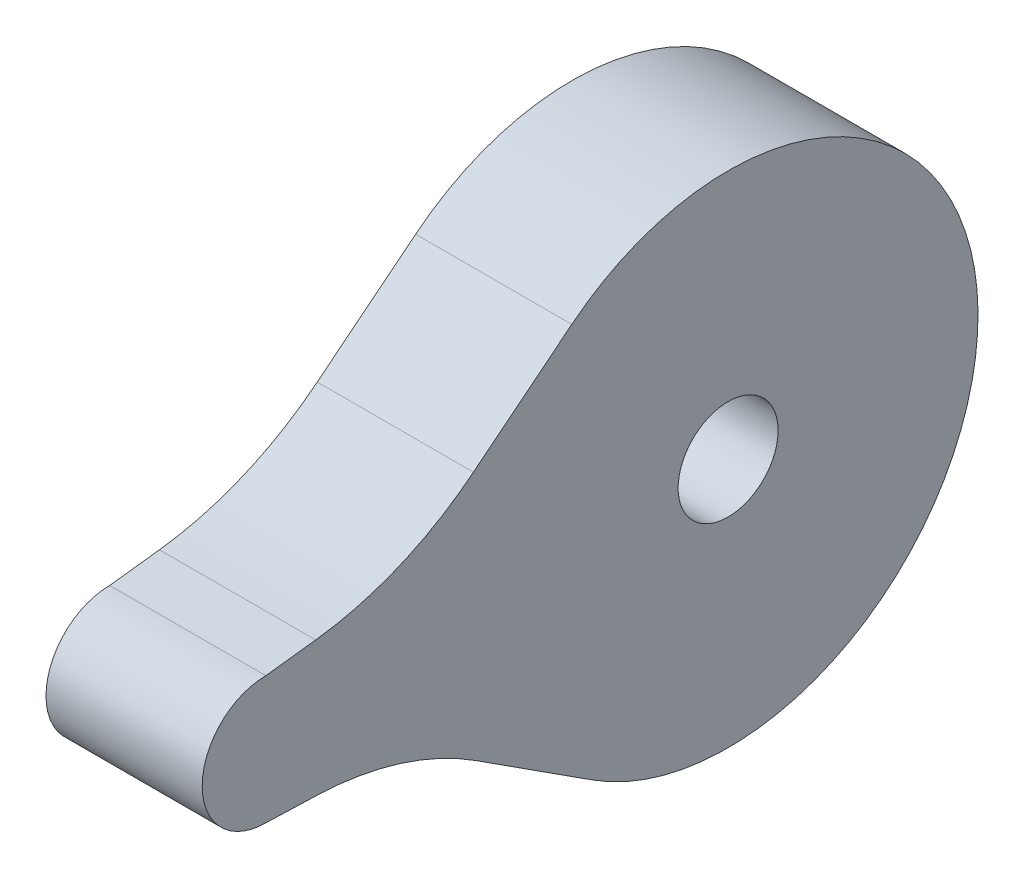
ISO-10303-21;
HEADER;
FILE_DESCRIPTION(('STEP AP214'),'2;1');
FILE_NAME('part.step','',(''),(''),'','','');
FILE_SCHEMA(('AUTOMOTIVE_DESIGN { 1 0 10303 214 1 1 1 1 }'));
ENDSEC;
DATA;
#1=APPLICATION_CONTEXT('core data for automotive mechanical design processes');
#2=APPLICATION_PROTOCOL_DEFINITION('international standard','automotive_design',2000,#1);
#3=PRODUCT_CONTEXT('',#1,'mechanical');
#4=PRODUCT('Part','Part','',(#3));
#5=PRODUCT_RELATED_PRODUCT_CATEGORY('part','',(#4));
#6=PRODUCT_DEFINITION_FORMATION('','',#4);
#7=PRODUCT_DEFINITION_CONTEXT('part definition',#1,'design');
#8=PRODUCT_DEFINITION('design','',#6,#7);
#9=PRODUCT_DEFINITION_SHAPE('','',#8);
#10=(LENGTH_UNIT() NAMED_UNIT(*) SI_UNIT(.MILLI.,.METRE.));
#11=(NAMED_UNIT(*) PLANE_ANGLE_UNIT() SI_UNIT($,.RADIAN.));
#12=(NAMED_UNIT(*) SI_UNIT($,.STERADIAN.) SOLID_ANGLE_UNIT());
#13=UNCERTAINTY_MEASURE_WITH_UNIT(LENGTH_MEASURE(1.E-05),#10,'distance_accuracy_value','');
#14=(GEOMETRIC_REPRESENTATION_CONTEXT(3) GLOBAL_UNCERTAINTY_ASSIGNED_CONTEXT((#13)) GLOBAL_UNIT_ASSIGNED_CONTEXT((#10,
#11,#12)) REPRESENTATION_CONTEXT('',''));
#15=CARTESIAN_POINT('',(0.,0.,0.));
#16=DIRECTION('',(0.,0.,1.));
#17=DIRECTION('',(1.,0.,0.));
#18=AXIS2_PLACEMENT_3D('',#15,#16,#17);
#19=CARTESIAN_POINT('',(5.,0.,0.));
#20=DIRECTION('',(-1.,0.,0.));
#21=DIRECTION('',(0.,0.,1.));
#22=AXIS2_PLACEMENT_3D('',#19,#20,#21);
#23=CYLINDRICAL_SURFACE('',#22,8.);
#24=DIRECTION('',(1.,0.,0.));
#25=VECTOR('',#24,1.);
#26=CARTESIAN_POINT('',(0.,6.2419942638276,5.00374935526785));
#27=LINE('',#26,#25);
#28=CARTESIAN_POINT('',(0.,6.2419942638276,5.00374935526785));
#29=VERTEX_POINT('',#28);
#30=CARTESIAN_POINT('',(5.,6.2419942638276,5.00374935526785));
#31=VERTEX_POINT('',#30);
#32=EDGE_CURVE('E119',#29,#31,#27,.T.);
#33=ORIENTED_EDGE('',*,*,#32,.T.);
#34=CARTESIAN_POINT('',(5.,0.,0.));
#35=DIRECTION('',(1.,0.,0.));
#36=DIRECTION('',(0.,0.,-1.));
#37=AXIS2_PLACEMENT_3D('',#34,#35,#36);
#38=CIRCLE('',#37,8.);
#39=CARTESIAN_POINT('',(5.,-6.72605530226976,4.33130235273513));
#40=VERTEX_POINT('',#39);
#41=EDGE_CURVE('E118',#40,#31,#38,.T.);
#42=ORIENTED_EDGE('',*,*,#41,.F.);
#43=DIRECTION('',(1.,0.,0.));
#44=VECTOR('',#43,1.);
#45=CARTESIAN_POINT('',(0.,-6.72605530226976,4.33130235273513));
#46=LINE('',#45,#44);
#47=CARTESIAN_POINT('',(0.,-6.72605530226976,4.33130235273513));
#48=VERTEX_POINT('',#47);
#49=EDGE_CURVE('E105',#48,#40,#46,.T.);
#50=ORIENTED_EDGE('',*,*,#49,.F.);
#51=CARTESIAN_POINT('',(0.,0.,0.));
#52=DIRECTION('',(1.,0.,0.));
#53=DIRECTION('',(0.,0.,-1.));
#54=AXIS2_PLACEMENT_3D('',#51,#52,#53);
#55=CIRCLE('',#54,8.);
#56=EDGE_CURVE('E116',#48,#29,#55,.T.);
#57=ORIENTED_EDGE('',*,*,#56,.T.);
#58=EDGE_LOOP('',(#33,#42,#50,#57));
#59=FACE_BOUND('',#58,.T.);
#60=ADVANCED_FACE('F41',(#59),#23,.T.);
#61=CARTESIAN_POINT('',(5.,0.,0.));
#62=DIRECTION('',(1.,0.,0.));
#63=DIRECTION('',(0.,0.,-1.));
#64=AXIS2_PLACEMENT_3D('',#61,#62,#63);
#65=PLANE('',#64);
#66=ORIENTED_EDGE('',*,*,#41,.T.);
#67=DIRECTION('',(0.,0.625468669408481,-0.780249282978449));
#68=VECTOR('',#67,1.);
#69=CARTESIAN_POINT('',(5.,6.2419942638276,5.00374935526785));
#70=LINE('',#69,#68);
#71=CARTESIAN_POINT('',(5.,3.71769972488574,8.15271444395642));
#72=VERTEX_POINT('',#71);
#73=EDGE_CURVE('E162',#72,#31,#70,.T.);
#74=ORIENTED_EDGE('',*,*,#73,.F.);
#75=CARTESIAN_POINT('',(5.,11.5201925546702,14.4074011380412));
#76=DIRECTION('',(1.,0.,0.));
#77=DIRECTION('',(0.,0.,-1.));
#78=AXIS2_PLACEMENT_3D('',#75,#76,#77);
#79=CIRCLE('',#78,10.);
#80=CARTESIAN_POINT('',(5.,1.59297403729244,13.2031036215481));
#81=VERTEX_POINT('',#80);
#82=EDGE_CURVE('E139',#72,#81,#79,.F.);
#83=ORIENTED_EDGE('',*,*,#82,.T.);
#84=DIRECTION('',(0.,0.120429751649314,-0.992721851737779));
#85=VECTOR('',#84,1.);
#86=CARTESIAN_POINT('',(5.,3.14834451302601,0.381934120969017));
#87=LINE('',#86,#85);
#88=CARTESIAN_POINT('',(5.,1.39971696693208,14.796152798534));
#89=VERTEX_POINT('',#88);
#90=EDGE_CURVE('E168',#89,#81,#87,.T.);
#91=ORIENTED_EDGE('',*,*,#90,.F.);
#92=CARTESIAN_POINT('',(5.,-0.640283033067922,14.796152798534));
#93=DIRECTION('',(1.,0.,0.));
#94=DIRECTION('',(0.,0.,-1.));
#95=AXIS2_PLACEMENT_3D('',#92,#93,#94);
#96=CIRCLE('',#95,2.04);
#97=CARTESIAN_POINT('',(5.,-2.68028303306792,14.796152798534));
#98=VERTEX_POINT('',#97);
#99=EDGE_CURVE('E159',#89,#98,#96,.T.);
#100=ORIENTED_EDGE('',*,*,#99,.T.);
#101=DIRECTION('',(0.,-0.0347444611622617,-0.999396228939525));
#102=VECTOR('',#101,1.);
#103=CARTESIAN_POINT('',(5.,-3.19082142248105,0.110930347522668));
#104=LINE('',#103,#102);
#105=CARTESIAN_POINT('',(5.,-2.73831081354684,13.1270307847106));
#106=VERTEX_POINT('',#105);
#107=EDGE_CURVE('E151',#98,#106,#104,.T.);
#108=ORIENTED_EDGE('',*,*,#107,.T.);
#109=CARTESIAN_POINT('',(5.,-12.7322731029421,13.4744753963332));
#110=DIRECTION('',(1.,0.,0.));
#111=DIRECTION('',(0.,0.,-1.));
#112=AXIS2_PLACEMENT_3D('',#109,#110,#111);
#113=CIRCLE('',#112,10.);
#114=CARTESIAN_POINT('',(5.,-4.32470397510489,8.06034745541431));
#115=VERTEX_POINT('',#114);
#116=EDGE_CURVE('E49',#106,#115,#113,.F.);
#117=ORIENTED_EDGE('',*,*,#116,.T.);
#118=DIRECTION('',(0.,-0.541412794091891,-0.84075691278372));
#119=VECTOR('',#118,1.);
#120=CARTESIAN_POINT('',(5.,-6.72605530226976,4.33130235273513));
#121=LINE('',#120,#119);
#122=EDGE_CURVE('E160',#115,#40,#121,.T.);
#123=ORIENTED_EDGE('',*,*,#122,.T.);
#124=EDGE_LOOP('',(#66,#74,#83,#91,#100,#108,#117,#123));
#125=FACE_BOUND('',#124,.T.);
#126=CARTESIAN_POINT('',(5.,0.,0.));
#127=DIRECTION('',(1.,0.,0.));
#128=DIRECTION('',(0.,0.,-1.));
#129=AXIS2_PLACEMENT_3D('',#126,#127,#128);
#130=CIRCLE('',#129,1.6);
#131=CARTESIAN_POINT('',(5.,0.,-1.6));
#132=VERTEX_POINT('',#131);
#133=EDGE_CURVE('E126',#132,#132,#130,.T.);
#134=ORIENTED_EDGE('',*,*,#133,.F.);
#135=EDGE_LOOP('',(#134));
#136=FACE_BOUND('',#135,.T.);
#137=ADVANCED_FACE('F155',(#125,#136),#65,.T.);
#138=CARTESIAN_POINT('',(0.,0.,0.));
#139=DIRECTION('',(1.,0.,0.));
#140=DIRECTION('',(0.,0.,-1.));
#141=AXIS2_PLACEMENT_3D('',#138,#139,#140);
#142=PLANE('',#141);
#143=ORIENTED_EDGE('',*,*,#56,.F.);
#144=DIRECTION('',(0.,-0.541412794091891,-0.84075691278372));
#145=VECTOR('',#144,1.);
#146=CARTESIAN_POINT('',(0.,-6.72605530226976,4.33130235273513));
#147=LINE('',#146,#145);
#148=CARTESIAN_POINT('',(0.,-4.32470397510489,8.06034745541431));
#149=VERTEX_POINT('',#148);
#150=EDGE_CURVE('E102',#149,#48,#147,.T.);
#151=ORIENTED_EDGE('',*,*,#150,.F.);
#152=CARTESIAN_POINT('',(0.,-12.7322731029421,13.4744753963332));
#153=DIRECTION('',(1.,0.,0.));
#154=DIRECTION('',(0.,0.,-1.));
#155=AXIS2_PLACEMENT_3D('',#152,#153,#154);
#156=CIRCLE('',#155,10.);
#157=CARTESIAN_POINT('',(0.,-2.73831081354684,13.1270307847106));
#158=VERTEX_POINT('',#157);
#159=EDGE_CURVE('E12',#149,#158,#156,.T.);
#160=ORIENTED_EDGE('',*,*,#159,.T.);
#161=DIRECTION('',(0.,-0.0347444611622617,-0.999396228939525));
#162=VECTOR('',#161,1.);
#163=CARTESIAN_POINT('',(0.,-3.19082142248105,0.110930347522668));
#164=LINE('',#163,#162);
#165=CARTESIAN_POINT('',(0.,-2.68028303306792,14.796152798534));
#166=VERTEX_POINT('',#165);
#167=EDGE_CURVE('E111',#166,#158,#164,.T.);
#168=ORIENTED_EDGE('',*,*,#167,.F.);
#169=CARTESIAN_POINT('',(0.,-0.640283033067922,14.796152798534));
#170=DIRECTION('',(1.,0.,0.));
#171=DIRECTION('',(0.,0.,-1.));
#172=AXIS2_PLACEMENT_3D('',#169,#170,#171);
#173=CIRCLE('',#172,2.04);
#174=CARTESIAN_POINT('',(0.,1.39971696693208,14.796152798534));
#175=VERTEX_POINT('',#174);
#176=EDGE_CURVE('E120',#175,#166,#173,.T.);
#177=ORIENTED_EDGE('',*,*,#176,.F.);
#178=DIRECTION('',(0.,0.120429751649314,-0.992721851737779));
#179=VECTOR('',#178,1.);
#180=CARTESIAN_POINT('',(0.,3.14834451302601,0.381934120969017));
#181=LINE('',#180,#179);
#182=CARTESIAN_POINT('',(0.,1.59297403729244,13.2031036215481));
#183=VERTEX_POINT('',#182);
#184=EDGE_CURVE('E213',#175,#183,#181,.T.);
#185=ORIENTED_EDGE('',*,*,#184,.T.);
#186=CARTESIAN_POINT('',(0.,11.5201925546702,14.4074011380412));
#187=DIRECTION('',(1.,0.,0.));
#188=DIRECTION('',(0.,0.,-1.));
#189=AXIS2_PLACEMENT_3D('',#186,#187,#188);
#190=CIRCLE('',#189,10.);
#191=CARTESIAN_POINT('',(0.,3.71769972488574,8.15271444395642));
#192=VERTEX_POINT('',#191);
#193=EDGE_CURVE('E141',#183,#192,#190,.T.);
#194=ORIENTED_EDGE('',*,*,#193,.T.);
#195=DIRECTION('',(0.,0.625468669408481,-0.780249282978449));
#196=VECTOR('',#195,1.);
#197=CARTESIAN_POINT('',(0.,6.2419942638276,5.00374935526785));
#198=LINE('',#197,#196);
#199=EDGE_CURVE('E110',#192,#29,#198,.T.);
#200=ORIENTED_EDGE('',*,*,#199,.T.);
#201=EDGE_LOOP('',(#143,#151,#160,#168,#177,#185,#194,#200));
#202=FACE_BOUND('',#201,.T.);
#203=CARTESIAN_POINT('',(0.,0.,0.));
#204=DIRECTION('',(1.,0.,0.));
#205=DIRECTION('',(0.,0.,-1.));
#206=AXIS2_PLACEMENT_3D('',#203,#204,#205);
#207=CIRCLE('',#206,1.6);
#208=CARTESIAN_POINT('',(0.,0.,-1.6));
#209=VERTEX_POINT('',#208);
#210=EDGE_CURVE('E131',#209,#209,#207,.T.);
#211=ORIENTED_EDGE('',*,*,#210,.T.);
#212=EDGE_LOOP('',(#211));
#213=FACE_BOUND('',#212,.T.);
#214=ADVANCED_FACE('F122',(#202,#213),#142,.F.);
#215=CARTESIAN_POINT('',(5.,0.,0.));
#216=DIRECTION('',(-1.,0.,0.));
#217=DIRECTION('',(0.,0.,1.));
#218=AXIS2_PLACEMENT_3D('',#215,#216,#217);
#219=CYLINDRICAL_SURFACE('',#218,1.6);
#220=ORIENTED_EDGE('',*,*,#133,.T.);
#221=EDGE_LOOP('',(#220));
#222=FACE_BOUND('',#221,.T.);
#223=ORIENTED_EDGE('',*,*,#210,.F.);
#224=EDGE_LOOP('',(#223));
#225=FACE_BOUND('',#224,.T.);
#226=ADVANCED_FACE('F179',(#222,#225),#219,.F.);
#227=CARTESIAN_POINT('',(0.,-3.19082142248105,0.110930347522668));
#228=DIRECTION('',(0.,-0.999396228939525,0.0347444611622617));
#229=DIRECTION('',(0.,-0.0347444611622617,-0.999396228939525));
#230=AXIS2_PLACEMENT_3D('',#227,#228,#229);
#231=PLANE('',#230);
#232=ORIENTED_EDGE('',*,*,#167,.T.);
#233=DIRECTION('',(1.,0.,0.));
#234=VECTOR('',#233,1.);
#235=CARTESIAN_POINT('',(5.,-2.73831081354684,13.1270307847106));
#236=LINE('',#235,#234);
#237=EDGE_CURVE('E143',#158,#106,#236,.T.);
#238=ORIENTED_EDGE('',*,*,#237,.T.);
#239=ORIENTED_EDGE('',*,*,#107,.F.);
#240=DIRECTION('',(1.,0.,0.));
#241=VECTOR('',#240,1.);
#242=CARTESIAN_POINT('',(0.,-2.68028303306792,14.796152798534));
#243=LINE('',#242,#241);
#244=EDGE_CURVE('E172',#166,#98,#243,.T.);
#245=ORIENTED_EDGE('',*,*,#244,.F.);
#246=EDGE_LOOP('',(#232,#238,#239,#245));
#247=FACE_BOUND('',#246,.T.);
#248=ADVANCED_FACE('F150',(#247),#231,.T.);
#249=CARTESIAN_POINT('',(0.,-0.640283033067922,14.796152798534));
#250=DIRECTION('',(1.,0.,0.));
#251=DIRECTION('',(0.,0.,-1.));
#252=AXIS2_PLACEMENT_3D('',#249,#250,#251);
#253=CYLINDRICAL_SURFACE('',#252,2.04);
#254=ORIENTED_EDGE('',*,*,#99,.F.);
#255=DIRECTION('',(1.,0.,0.));
#256=VECTOR('',#255,1.);
#257=CARTESIAN_POINT('',(0.,1.39971696693208,14.796152798534));
#258=LINE('',#257,#256);
#259=EDGE_CURVE('E174',#175,#89,#258,.T.);
#260=ORIENTED_EDGE('',*,*,#259,.F.);
#261=ORIENTED_EDGE('',*,*,#176,.T.);
#262=ORIENTED_EDGE('',*,*,#244,.T.);
#263=EDGE_LOOP('',(#254,#260,#261,#262));
#264=FACE_BOUND('',#263,.T.);
#265=ADVANCED_FACE('F187',(#264),#253,.T.);
#266=CARTESIAN_POINT('',(0.,3.14834451302601,0.381934120969017));
#267=DIRECTION('',(0.,-0.992721851737779,-0.120429751649314));
#268=DIRECTION('',(0.,0.120429751649314,-0.992721851737779));
#269=AXIS2_PLACEMENT_3D('',#266,#267,#268);
#270=PLANE('',#269);
#271=ORIENTED_EDGE('',*,*,#90,.T.);
#272=DIRECTION('',(1.,0.,0.));
#273=VECTOR('',#272,1.);
#274=CARTESIAN_POINT('',(0.,1.59297403729244,13.2031036215481));
#275=LINE('',#274,#273);
#276=EDGE_CURVE('E137',#81,#183,#275,.F.);
#277=ORIENTED_EDGE('',*,*,#276,.T.);
#278=ORIENTED_EDGE('',*,*,#184,.F.);
#279=ORIENTED_EDGE('',*,*,#259,.T.);
#280=EDGE_LOOP('',(#271,#277,#278,#279));
#281=FACE_BOUND('',#280,.T.);
#282=ADVANCED_FACE('F221',(#281),#270,.F.);
#283=CARTESIAN_POINT('',(0.,6.2419942638276,5.00374935526785));
#284=DIRECTION('',(0.,-0.780249282978449,-0.625468669408481));
#285=DIRECTION('',(0.,0.625468669408481,-0.780249282978449));
#286=AXIS2_PLACEMENT_3D('',#283,#284,#285);
#287=PLANE('',#286);
#288=ORIENTED_EDGE('',*,*,#199,.F.);
#289=DIRECTION('',(1.,0.,0.));
#290=VECTOR('',#289,1.);
#291=CARTESIAN_POINT('',(5.,3.71769972488574,8.15271444395642));
#292=LINE('',#291,#290);
#293=EDGE_CURVE('E128',#192,#72,#292,.T.);
#294=ORIENTED_EDGE('',*,*,#293,.T.);
#295=ORIENTED_EDGE('',*,*,#73,.T.);
#296=ORIENTED_EDGE('',*,*,#32,.F.);
#297=EDGE_LOOP('',(#288,#294,#295,#296));
#298=FACE_BOUND('',#297,.T.);
#299=ADVANCED_FACE('F205',(#298),#287,.F.);
#300=CARTESIAN_POINT('',(0.,-6.72605530226976,4.33130235273513));
#301=DIRECTION('',(0.,-0.84075691278372,0.541412794091891));
#302=DIRECTION('',(0.,-0.541412794091891,-0.84075691278372));
#303=AXIS2_PLACEMENT_3D('',#300,#301,#302);
#304=PLANE('',#303);
#305=ORIENTED_EDGE('',*,*,#122,.F.);
#306=DIRECTION('',(1.,0.,0.));
#307=VECTOR('',#306,1.);
#308=CARTESIAN_POINT('',(0.,-4.32470397510489,8.06034745541431));
#309=LINE('',#308,#307);
#310=EDGE_CURVE('E56',#115,#149,#309,.F.);
#311=ORIENTED_EDGE('',*,*,#310,.T.);
#312=ORIENTED_EDGE('',*,*,#150,.T.);
#313=ORIENTED_EDGE('',*,*,#49,.T.);
#314=EDGE_LOOP('',(#305,#311,#312,#313));
#315=FACE_BOUND('',#314,.T.);
#316=ADVANCED_FACE('F104',(#315),#304,.T.);
#317=CARTESIAN_POINT('',(0.,11.5201925546702,14.4074011380412));
#318=DIRECTION('',(-1.,0.,0.));
#319=DIRECTION('',(0.,0.,1.));
#320=AXIS2_PLACEMENT_3D('',#317,#318,#319);
#321=CYLINDRICAL_SURFACE('',#320,10.);
#322=ORIENTED_EDGE('',*,*,#193,.F.);
#323=ORIENTED_EDGE('',*,*,#276,.F.);
#324=ORIENTED_EDGE('',*,*,#82,.F.);
#325=ORIENTED_EDGE('',*,*,#293,.F.);
#326=EDGE_LOOP('',(#322,#323,#324,#325));
#327=FACE_BOUND('',#326,.T.);
#328=ADVANCED_FACE('F198',(#327),#321,.F.);
#329=CARTESIAN_POINT('',(0.,-12.7322731029421,13.4744753963332));
#330=DIRECTION('',(-1.,0.,0.));
#331=DIRECTION('',(0.,0.,1.));
#332=AXIS2_PLACEMENT_3D('',#329,#330,#331);
#333=CYLINDRICAL_SURFACE('',#332,10.);
#334=ORIENTED_EDGE('',*,*,#159,.F.);
#335=ORIENTED_EDGE('',*,*,#310,.F.);
#336=ORIENTED_EDGE('',*,*,#116,.F.);
#337=ORIENTED_EDGE('',*,*,#237,.F.);
#338=EDGE_LOOP('',(#334,#335,#336,#337));
#339=FACE_BOUND('',#338,.T.);
#340=ADVANCED_FACE('F43',(#339),#333,.F.);
#341=CLOSED_SHELL('',(#60,#137,#214,#226,#248,#265,#282,#299,#316,#328,#340));
#342=MANIFOLD_SOLID_BREP('B2',#341);
#343=ADVANCED_BREP_SHAPE_REPRESENTATION('',(#18,#342),#14);
#344=SHAPE_DEFINITION_REPRESENTATION(#9,#343);
ENDSEC;
END-ISO-10303-21;
